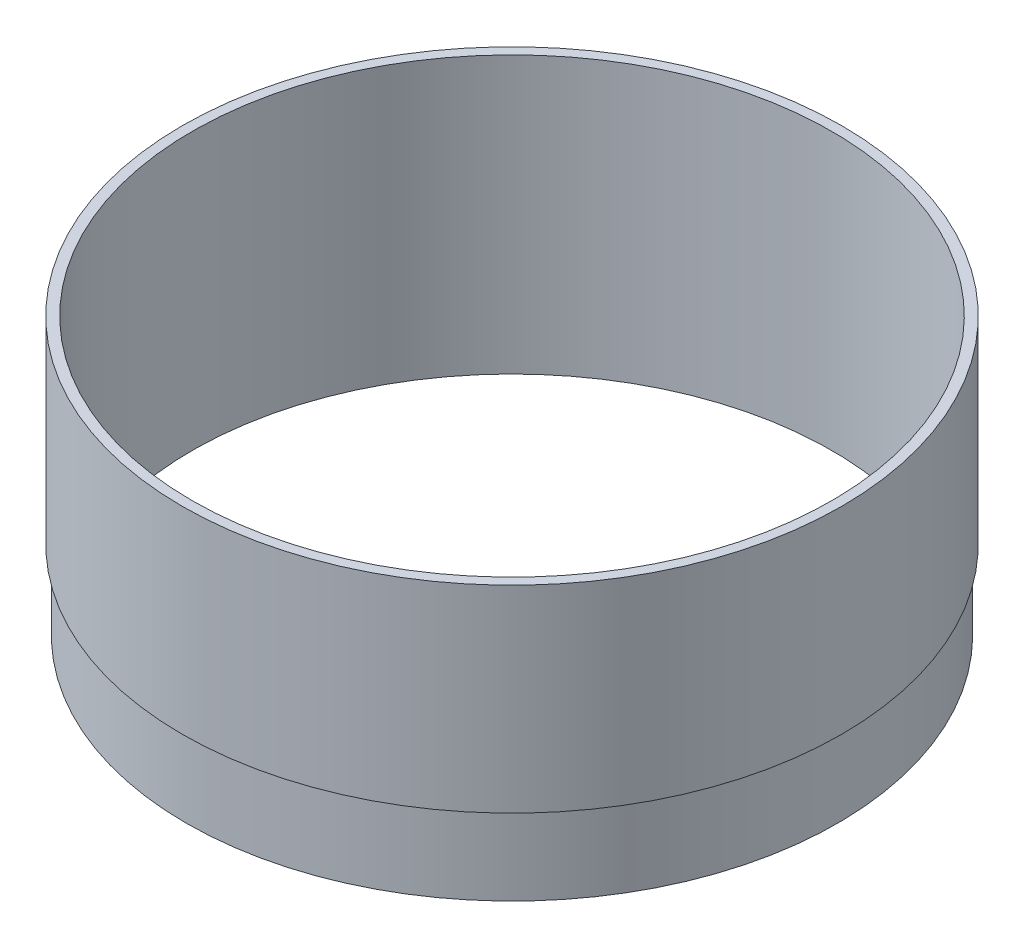
ISO-10303-21;
HEADER;
FILE_DESCRIPTION(('STEP AP214'),'2;1');
FILE_NAME('part.step','',(''),(''),'','','');
FILE_SCHEMA(('AUTOMOTIVE_DESIGN { 1 0 10303 214 1 1 1 1 }'));
ENDSEC;
DATA;
#1=APPLICATION_CONTEXT('core data for automotive mechanical design processes');
#2=APPLICATION_PROTOCOL_DEFINITION('international standard','automotive_design',2000,#1);
#3=PRODUCT_CONTEXT('',#1,'mechanical');
#4=PRODUCT('Part','Part','',(#3));
#5=PRODUCT_RELATED_PRODUCT_CATEGORY('part','',(#4));
#6=PRODUCT_DEFINITION_FORMATION('','',#4);
#7=PRODUCT_DEFINITION_CONTEXT('part definition',#1,'design');
#8=PRODUCT_DEFINITION('design','',#6,#7);
#9=PRODUCT_DEFINITION_SHAPE('','',#8);
#10=(LENGTH_UNIT() NAMED_UNIT(*) SI_UNIT(.MILLI.,.METRE.));
#11=(NAMED_UNIT(*) PLANE_ANGLE_UNIT() SI_UNIT($,.RADIAN.));
#12=(NAMED_UNIT(*) SI_UNIT($,.STERADIAN.) SOLID_ANGLE_UNIT());
#13=UNCERTAINTY_MEASURE_WITH_UNIT(LENGTH_MEASURE(1.E-05),#10,'distance_accuracy_value','');
#14=(GEOMETRIC_REPRESENTATION_CONTEXT(3) GLOBAL_UNCERTAINTY_ASSIGNED_CONTEXT((#13)) GLOBAL_UNIT_ASSIGNED_CONTEXT((#10,
#11,#12)) REPRESENTATION_CONTEXT('',''));
#15=CARTESIAN_POINT('',(0.,0.,0.));
#16=DIRECTION('',(0.,0.,1.));
#17=DIRECTION('',(1.,0.,0.));
#18=AXIS2_PLACEMENT_3D('',#15,#16,#17);
#19=CARTESIAN_POINT('',(0.,0.,0.));
#20=DIRECTION('',(0.,1.,0.));
#21=DIRECTION('',(0.,0.,1.));
#22=AXIS2_PLACEMENT_3D('',#19,#20,#21);
#23=PLANE('',#22);
#24=CARTESIAN_POINT('',(0.,0.,0.));
#25=DIRECTION('',(0.,1.,0.));
#26=DIRECTION('',(0.,0.,1.));
#27=AXIS2_PLACEMENT_3D('',#24,#25,#26);
#28=CIRCLE('',#27,16.5);
#29=CARTESIAN_POINT('',(0.,0.,16.5));
#30=VERTEX_POINT('',#29);
#31=EDGE_CURVE('E39',#30,#30,#28,.T.);
#32=ORIENTED_EDGE('',*,*,#31,.F.);
#33=EDGE_LOOP('',(#32));
#34=FACE_BOUND('',#33,.T.);
#35=CARTESIAN_POINT('',(0.,0.,0.));
#36=DIRECTION('',(0.,1.,0.));
#37=DIRECTION('',(0.,0.,1.));
#38=AXIS2_PLACEMENT_3D('',#35,#36,#37);
#39=CIRCLE('',#38,16.2);
#40=CARTESIAN_POINT('',(0.,0.,16.2));
#41=VERTEX_POINT('',#40);
#42=EDGE_CURVE('E46',#41,#41,#39,.T.);
#43=ORIENTED_EDGE('',*,*,#42,.T.);
#44=EDGE_LOOP('',(#43));
#45=FACE_BOUND('',#44,.T.);
#46=ADVANCED_FACE('F35',(#34,#45),#23,.F.);
#47=CARTESIAN_POINT('',(0.,4.,0.));
#48=DIRECTION('',(0.,-1.,0.));
#49=DIRECTION('',(0.,0.,-1.));
#50=AXIS2_PLACEMENT_3D('',#47,#48,#49);
#51=CYLINDRICAL_SURFACE('',#50,16.5);
#52=CARTESIAN_POINT('',(0.,4.,0.));
#53=DIRECTION('',(0.,1.,0.));
#54=DIRECTION('',(0.,0.,1.));
#55=AXIS2_PLACEMENT_3D('',#52,#53,#54);
#56=CIRCLE('',#55,16.5);
#57=CARTESIAN_POINT('',(0.,4.,16.5));
#58=VERTEX_POINT('',#57);
#59=EDGE_CURVE('E10',#58,#58,#56,.T.);
#60=ORIENTED_EDGE('',*,*,#59,.F.);
#61=EDGE_LOOP('',(#60));
#62=FACE_BOUND('',#61,.T.);
#63=ORIENTED_EDGE('',*,*,#31,.T.);
#64=EDGE_LOOP('',(#63));
#65=FACE_BOUND('',#64,.T.);
#66=ADVANCED_FACE('F37',(#62,#65),#51,.T.);
#67=CARTESIAN_POINT('',(0.,4.,0.));
#68=DIRECTION('',(0.,-1.,0.));
#69=DIRECTION('',(0.,0.,-1.));
#70=AXIS2_PLACEMENT_3D('',#67,#68,#69);
#71=CYLINDRICAL_SURFACE('',#70,16.2);
#72=ORIENTED_EDGE('',*,*,#42,.F.);
#73=EDGE_LOOP('',(#72));
#74=FACE_BOUND('',#73,.T.);
#75=CARTESIAN_POINT('',(0.,14.,0.));
#76=DIRECTION('',(0.,1.,0.));
#77=DIRECTION('',(0.,0.,1.));
#78=AXIS2_PLACEMENT_3D('',#75,#76,#77);
#79=CIRCLE('',#78,16.2);
#80=CARTESIAN_POINT('',(0.,14.,16.2));
#81=VERTEX_POINT('',#80);
#82=EDGE_CURVE('E54',#81,#81,#79,.T.);
#83=ORIENTED_EDGE('',*,*,#82,.T.);
#84=EDGE_LOOP('',(#83));
#85=FACE_BOUND('',#84,.T.);
#86=ADVANCED_FACE('F60',(#74,#85),#71,.F.);
#87=CARTESIAN_POINT('',(0.,14.,0.));
#88=DIRECTION('',(0.,1.,0.));
#89=DIRECTION('',(0.,0.,1.));
#90=AXIS2_PLACEMENT_3D('',#87,#88,#89);
#91=PLANE('',#90);
#92=CARTESIAN_POINT('',(0.,14.,0.));
#93=DIRECTION('',(0.,1.,0.));
#94=DIRECTION('',(0.,0.,1.));
#95=AXIS2_PLACEMENT_3D('',#92,#93,#94);
#96=CIRCLE('',#95,16.7);
#97=CARTESIAN_POINT('',(0.,14.,16.7));
#98=VERTEX_POINT('',#97);
#99=EDGE_CURVE('E50',#98,#98,#96,.T.);
#100=ORIENTED_EDGE('',*,*,#99,.T.);
#101=EDGE_LOOP('',(#100));
#102=FACE_BOUND('',#101,.T.);
#103=ORIENTED_EDGE('',*,*,#82,.F.);
#104=EDGE_LOOP('',(#103));
#105=FACE_BOUND('',#104,.T.);
#106=ADVANCED_FACE('F62',(#102,#105),#91,.T.);
#107=CARTESIAN_POINT('',(0.,4.,0.));
#108=DIRECTION('',(0.,1.,0.));
#109=DIRECTION('',(0.,0.,1.));
#110=AXIS2_PLACEMENT_3D('',#107,#108,#109);
#111=PLANE('',#110);
#112=ORIENTED_EDGE('',*,*,#59,.T.);
#113=EDGE_LOOP('',(#112));
#114=FACE_BOUND('',#113,.T.);
#115=CARTESIAN_POINT('',(0.,4.,0.));
#116=DIRECTION('',(0.,1.,0.));
#117=DIRECTION('',(0.,0.,1.));
#118=AXIS2_PLACEMENT_3D('',#115,#116,#117);
#119=CIRCLE('',#118,16.7);
#120=CARTESIAN_POINT('',(0.,4.,16.7));
#121=VERTEX_POINT('',#120);
#122=EDGE_CURVE('E51',#121,#121,#119,.T.);
#123=ORIENTED_EDGE('',*,*,#122,.F.);
#124=EDGE_LOOP('',(#123));
#125=FACE_BOUND('',#124,.T.);
#126=ADVANCED_FACE('F64',(#114,#125),#111,.F.);
#127=CARTESIAN_POINT('',(0.,14.,0.));
#128=DIRECTION('',(0.,-1.,0.));
#129=DIRECTION('',(0.,0.,-1.));
#130=AXIS2_PLACEMENT_3D('',#127,#128,#129);
#131=CYLINDRICAL_SURFACE('',#130,16.7);
#132=ORIENTED_EDGE('',*,*,#99,.F.);
#133=EDGE_LOOP('',(#132));
#134=FACE_BOUND('',#133,.T.);
#135=ORIENTED_EDGE('',*,*,#122,.T.);
#136=EDGE_LOOP('',(#135));
#137=FACE_BOUND('',#136,.T.);
#138=ADVANCED_FACE('F71',(#134,#137),#131,.T.);
#139=CLOSED_SHELL('',(#46,#66,#86,#106,#126,#138));
#140=MANIFOLD_SOLID_BREP('B2',#139);
#141=ADVANCED_BREP_SHAPE_REPRESENTATION('',(#18,#140),#14);
#142=SHAPE_DEFINITION_REPRESENTATION(#9,#141);
ENDSEC;
END-ISO-10303-21;
